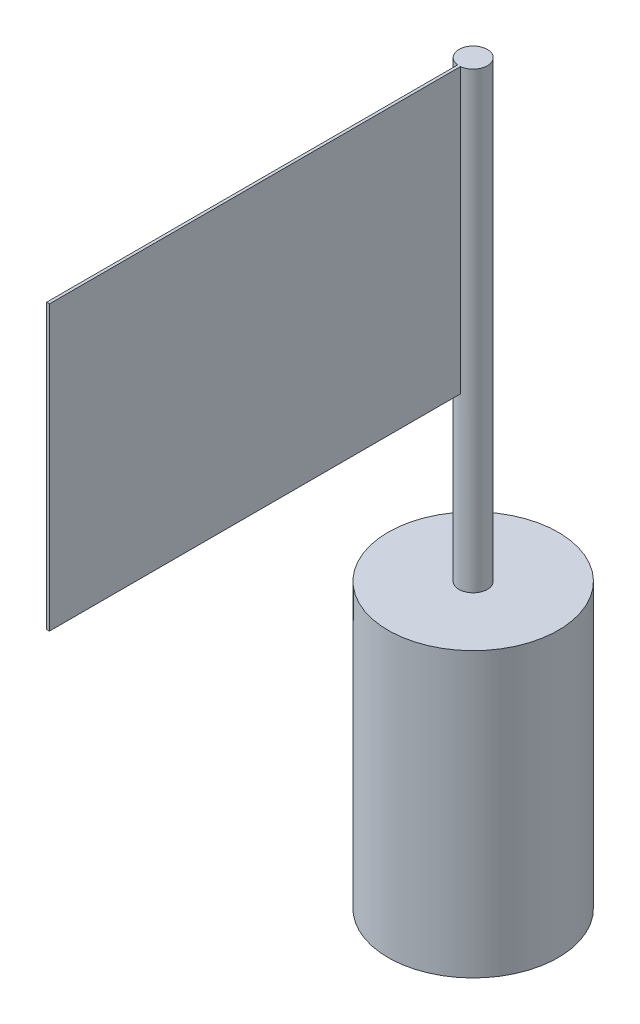
ISO-10303-21;
HEADER;
FILE_DESCRIPTION(('STEP AP214'),'2;1');
FILE_NAME('part.step','',(''),(''),'','','');
FILE_SCHEMA(('AUTOMOTIVE_DESIGN { 1 0 10303 214 1 1 1 1 }'));
ENDSEC;
DATA;
#1=APPLICATION_CONTEXT('core data for automotive mechanical design processes');
#2=APPLICATION_PROTOCOL_DEFINITION('international standard','automotive_design',2000,#1);
#3=PRODUCT_CONTEXT('',#1,'mechanical');
#4=PRODUCT('Part','Part','',(#3));
#5=PRODUCT_RELATED_PRODUCT_CATEGORY('part','',(#4));
#6=PRODUCT_DEFINITION_FORMATION('','',#4);
#7=PRODUCT_DEFINITION_CONTEXT('part definition',#1,'design');
#8=PRODUCT_DEFINITION('design','',#6,#7);
#9=PRODUCT_DEFINITION_SHAPE('','',#8);
#10=(LENGTH_UNIT() NAMED_UNIT(*) SI_UNIT(.MILLI.,.METRE.));
#11=(NAMED_UNIT(*) PLANE_ANGLE_UNIT() SI_UNIT($,.RADIAN.));
#12=(NAMED_UNIT(*) SI_UNIT($,.STERADIAN.) SOLID_ANGLE_UNIT());
#13=UNCERTAINTY_MEASURE_WITH_UNIT(LENGTH_MEASURE(1.E-05),#10,'distance_accuracy_value','');
#14=(GEOMETRIC_REPRESENTATION_CONTEXT(3) GLOBAL_UNCERTAINTY_ASSIGNED_CONTEXT((#13)) GLOBAL_UNIT_ASSIGNED_CONTEXT((#10,
#11,#12)) REPRESENTATION_CONTEXT('',''));
#15=CARTESIAN_POINT('',(0.,0.,0.));
#16=DIRECTION('',(0.,0.,1.));
#17=DIRECTION('',(1.,0.,0.));
#18=AXIS2_PLACEMENT_3D('',#15,#16,#17);
#19=CARTESIAN_POINT('',(0.,260.,0.));
#20=DIRECTION('',(0.,1.,0.));
#21=DIRECTION('',(-1.,0.,0.));
#22=AXIS2_PLACEMENT_3D('',#19,#20,#21);
#23=CYLINDRICAL_SURFACE('',#22,4.99999999999999);
#24=CARTESIAN_POINT('',(0.,100.,0.));
#25=DIRECTION('',(0.,1.,0.));
#26=DIRECTION('',(-1.,0.,0.));
#27=AXIS2_PLACEMENT_3D('',#24,#25,#26);
#28=CIRCLE('',#27,4.99999999999999);
#29=CARTESIAN_POINT('',(-5.,100.,0.));
#30=VERTEX_POINT('',#29);
#31=EDGE_CURVE('E108',#30,#30,#28,.T.);
#32=ORIENTED_EDGE('',*,*,#31,.T.);
#33=EDGE_LOOP('',(#32));
#34=FACE_BOUND('',#33,.T.);
#35=CARTESIAN_POINT('',(0.,260.,0.));
#36=DIRECTION('',(0.,1.,0.));
#37=DIRECTION('',(-1.,0.,0.));
#38=AXIS2_PLACEMENT_3D('',#35,#36,#37);
#39=CIRCLE('',#38,4.99999999999999);
#40=CARTESIAN_POINT('',(0.499999999999977,260.,4.97493718553307));
#41=VERTEX_POINT('',#40);
#42=CARTESIAN_POINT('',(-0.500000000000023,260.,4.97493718553307));
#43=VERTEX_POINT('',#42);
#44=EDGE_CURVE('E106',#41,#43,#39,.T.);
#45=ORIENTED_EDGE('',*,*,#44,.F.);
#46=DIRECTION('',(0.,1.,0.));
#47=VECTOR('',#46,1.);
#48=CARTESIAN_POINT('',(0.499999999999977,260.,4.97493718553309));
#49=LINE('',#48,#47);
#50=CARTESIAN_POINT('',(0.499999999999977,160.,4.97493718553309));
#51=VERTEX_POINT('',#50);
#52=EDGE_CURVE('E97',#41,#51,#49,.F.);
#53=ORIENTED_EDGE('',*,*,#52,.T.);
#54=CARTESIAN_POINT('',(0.,160.,0.));
#55=DIRECTION('',(0.,1.,0.));
#56=DIRECTION('',(0.,0.,1.));
#57=AXIS2_PLACEMENT_3D('',#54,#55,#56);
#58=CIRCLE('',#57,4.99999999999999);
#59=CARTESIAN_POINT('',(-0.500000000000023,160.,4.97493718553309));
#60=VERTEX_POINT('',#59);
#61=EDGE_CURVE('E11',#51,#60,#58,.F.);
#62=ORIENTED_EDGE('',*,*,#61,.T.);
#63=DIRECTION('',(0.,1.,0.));
#64=VECTOR('',#63,1.);
#65=CARTESIAN_POINT('',(-0.500000000000023,260.,4.97493718553309));
#66=LINE('',#65,#64);
#67=EDGE_CURVE('E98',#60,#43,#66,.T.);
#68=ORIENTED_EDGE('',*,*,#67,.T.);
#69=EDGE_LOOP('',(#45,#53,#62,#68));
#70=FACE_BOUND('',#69,.T.);
#71=ADVANCED_FACE('F37',(#34,#70),#23,.T.);
#72=CARTESIAN_POINT('',(0.,0.,0.));
#73=DIRECTION('',(0.,-1.,0.));
#74=DIRECTION('',(1.,0.,0.));
#75=AXIS2_PLACEMENT_3D('',#72,#73,#74);
#76=PLANE('',#75);
#77=CARTESIAN_POINT('',(0.,0.,0.));
#78=DIRECTION('',(0.,1.,0.));
#79=DIRECTION('',(-1.,0.,0.));
#80=AXIS2_PLACEMENT_3D('',#77,#78,#79);
#81=CIRCLE('',#80,30.);
#82=CARTESIAN_POINT('',(-30.,0.,0.));
#83=VERTEX_POINT('',#82);
#84=EDGE_CURVE('E45',#83,#83,#81,.T.);
#85=ORIENTED_EDGE('',*,*,#84,.F.);
#86=EDGE_LOOP('',(#85));
#87=FACE_BOUND('',#86,.T.);
#88=ADVANCED_FACE('F39',(#87),#76,.T.);
#89=CARTESIAN_POINT('',(0.,260.,0.));
#90=DIRECTION('',(0.,1.,0.));
#91=DIRECTION('',(-1.,0.,0.));
#92=AXIS2_PLACEMENT_3D('',#89,#90,#91);
#93=CYLINDRICAL_SURFACE('',#92,30.);
#94=ORIENTED_EDGE('',*,*,#84,.T.);
#95=EDGE_LOOP('',(#94));
#96=FACE_BOUND('',#95,.T.);
#97=CARTESIAN_POINT('',(0.,100.,0.));
#98=DIRECTION('',(0.,1.,0.));
#99=DIRECTION('',(-1.,0.,0.));
#100=AXIS2_PLACEMENT_3D('',#97,#98,#99);
#101=CIRCLE('',#100,30.);
#102=CARTESIAN_POINT('',(-30.,100.,0.));
#103=VERTEX_POINT('',#102);
#104=EDGE_CURVE('E111',#103,#103,#101,.T.);
#105=ORIENTED_EDGE('',*,*,#104,.F.);
#106=EDGE_LOOP('',(#105));
#107=FACE_BOUND('',#106,.T.);
#108=ADVANCED_FACE('F116',(#96,#107),#93,.T.);
#109=CARTESIAN_POINT('',(-30.,100.,0.));
#110=DIRECTION('',(0.,1.,0.));
#111=DIRECTION('',(-1.,0.,0.));
#112=AXIS2_PLACEMENT_3D('',#109,#110,#111);
#113=PLANE('',#112);
#114=ORIENTED_EDGE('',*,*,#104,.T.);
#115=EDGE_LOOP('',(#114));
#116=FACE_BOUND('',#115,.T.);
#117=ORIENTED_EDGE('',*,*,#31,.F.);
#118=EDGE_LOOP('',(#117));
#119=FACE_BOUND('',#118,.T.);
#120=ADVANCED_FACE('F124',(#116,#119),#113,.T.);
#121=CARTESIAN_POINT('',(-5.,260.,0.));
#122=DIRECTION('',(0.,1.,0.));
#123=DIRECTION('',(-1.,0.,0.));
#124=AXIS2_PLACEMENT_3D('',#121,#122,#123);
#125=PLANE('',#124);
#126=ORIENTED_EDGE('',*,*,#44,.T.);
#127=DIRECTION('',(0.,0.,-1.));
#128=VECTOR('',#127,1.);
#129=CARTESIAN_POINT('',(-0.500000000000023,260.,150.));
#130=LINE('',#129,#128);
#131=CARTESIAN_POINT('',(-0.500000000000023,260.,150.));
#132=VERTEX_POINT('',#131);
#133=EDGE_CURVE('E84',#132,#43,#130,.T.);
#134=ORIENTED_EDGE('',*,*,#133,.F.);
#135=DIRECTION('',(-1.,0.,0.));
#136=VECTOR('',#135,1.);
#137=CARTESIAN_POINT('',(-0.500000000000023,260.,150.));
#138=LINE('',#137,#136);
#139=CARTESIAN_POINT('',(0.499999999999977,260.,150.));
#140=VERTEX_POINT('',#139);
#141=EDGE_CURVE('E77',#140,#132,#138,.T.);
#142=ORIENTED_EDGE('',*,*,#141,.F.);
#143=DIRECTION('',(0.,0.,-1.));
#144=VECTOR('',#143,1.);
#145=CARTESIAN_POINT('',(0.499999999999977,260.,150.));
#146=LINE('',#145,#144);
#147=EDGE_CURVE('E82',#140,#41,#146,.T.);
#148=ORIENTED_EDGE('',*,*,#147,.T.);
#149=EDGE_LOOP('',(#126,#134,#142,#148));
#150=FACE_BOUND('',#149,.T.);
#151=ADVANCED_FACE('F80',(#150),#125,.T.);
#152=CARTESIAN_POINT('',(0.499999999999977,160.,150.));
#153=DIRECTION('',(-1.,0.,0.));
#154=DIRECTION('',(0.,0.,1.));
#155=AXIS2_PLACEMENT_3D('',#152,#153,#154);
#156=PLANE('',#155);
#157=ORIENTED_EDGE('',*,*,#52,.F.);
#158=ORIENTED_EDGE('',*,*,#147,.F.);
#159=DIRECTION('',(0.,1.,0.));
#160=VECTOR('',#159,1.);
#161=CARTESIAN_POINT('',(0.499999999999977,160.,150.));
#162=LINE('',#161,#160);
#163=CARTESIAN_POINT('',(0.499999999999977,160.,150.));
#164=VERTEX_POINT('',#163);
#165=EDGE_CURVE('E88',#164,#140,#162,.T.);
#166=ORIENTED_EDGE('',*,*,#165,.F.);
#167=DIRECTION('',(0.,0.,-1.));
#168=VECTOR('',#167,1.);
#169=CARTESIAN_POINT('',(0.499999999999977,160.,150.));
#170=LINE('',#169,#168);
#171=EDGE_CURVE('E221',#164,#51,#170,.T.);
#172=ORIENTED_EDGE('',*,*,#171,.T.);
#173=EDGE_LOOP('',(#157,#158,#166,#172));
#174=FACE_BOUND('',#173,.T.);
#175=ADVANCED_FACE('F95',(#174),#156,.F.);
#176=CARTESIAN_POINT('',(-0.500000000000023,160.,150.));
#177=DIRECTION('',(1.,0.,0.));
#178=DIRECTION('',(0.,0.,-1.));
#179=AXIS2_PLACEMENT_3D('',#176,#177,#178);
#180=PLANE('',#179);
#181=ORIENTED_EDGE('',*,*,#67,.F.);
#182=DIRECTION('',(0.,0.,-1.));
#183=VECTOR('',#182,1.);
#184=CARTESIAN_POINT('',(-0.500000000000023,160.,150.));
#185=LINE('',#184,#183);
#186=CARTESIAN_POINT('',(-0.500000000000023,160.,150.));
#187=VERTEX_POINT('',#186);
#188=EDGE_CURVE('E52',#187,#60,#185,.T.);
#189=ORIENTED_EDGE('',*,*,#188,.F.);
#190=DIRECTION('',(0.,-1.,0.));
#191=VECTOR('',#190,1.);
#192=CARTESIAN_POINT('',(-0.500000000000023,160.,150.));
#193=LINE('',#192,#191);
#194=EDGE_CURVE('E87',#132,#187,#193,.T.);
#195=ORIENTED_EDGE('',*,*,#194,.F.);
#196=ORIENTED_EDGE('',*,*,#133,.T.);
#197=EDGE_LOOP('',(#181,#189,#195,#196));
#198=FACE_BOUND('',#197,.T.);
#199=ADVANCED_FACE('F144',(#198),#180,.F.);
#200=CARTESIAN_POINT('',(-0.500000000000023,160.,150.));
#201=DIRECTION('',(0.,1.,0.));
#202=DIRECTION('',(0.,0.,1.));
#203=AXIS2_PLACEMENT_3D('',#200,#201,#202);
#204=PLANE('',#203);
#205=ORIENTED_EDGE('',*,*,#61,.F.);
#206=ORIENTED_EDGE('',*,*,#171,.F.);
#207=DIRECTION('',(1.,0.,0.));
#208=VECTOR('',#207,1.);
#209=CARTESIAN_POINT('',(-0.500000000000023,160.,150.));
#210=LINE('',#209,#208);
#211=EDGE_CURVE('E92',#187,#164,#210,.T.);
#212=ORIENTED_EDGE('',*,*,#211,.F.);
#213=ORIENTED_EDGE('',*,*,#188,.T.);
#214=EDGE_LOOP('',(#205,#206,#212,#213));
#215=FACE_BOUND('',#214,.T.);
#216=ADVANCED_FACE('F148',(#215),#204,.F.);
#217=CARTESIAN_POINT('',(0.,0.,150.));
#218=DIRECTION('',(0.,0.,-1.));
#219=DIRECTION('',(-1.,0.,0.));
#220=AXIS2_PLACEMENT_3D('',#217,#218,#219);
#221=PLANE('',#220);
#222=ORIENTED_EDGE('',*,*,#165,.T.);
#223=ORIENTED_EDGE('',*,*,#141,.T.);
#224=ORIENTED_EDGE('',*,*,#194,.T.);
#225=ORIENTED_EDGE('',*,*,#211,.T.);
#226=EDGE_LOOP('',(#222,#223,#224,#225));
#227=FACE_BOUND('',#226,.T.);
#228=ADVANCED_FACE('F91',(#227),#221,.F.);
#229=CLOSED_SHELL('',(#71,#88,#108,#120,#151,#175,#199,#216,#228));
#230=MANIFOLD_SOLID_BREP('B2',#229);
#231=ADVANCED_BREP_SHAPE_REPRESENTATION('',(#18,#230),#14);
#232=SHAPE_DEFINITION_REPRESENTATION(#9,#231);
ENDSEC;
END-ISO-10303-21;
